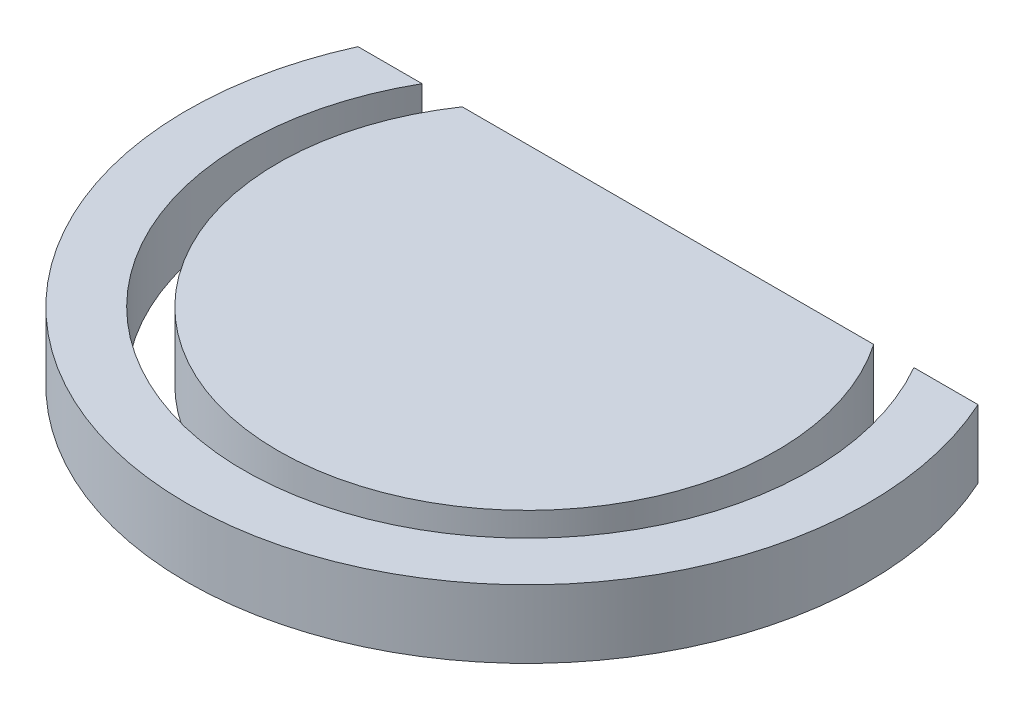
ISO-10303-21;
HEADER;
FILE_DESCRIPTION(('STEP AP214'),'2;1');
FILE_NAME('part.step','',(''),(''),'','','');
FILE_SCHEMA(('AUTOMOTIVE_DESIGN { 1 0 10303 214 1 1 1 1 }'));
ENDSEC;
DATA;
#1=APPLICATION_CONTEXT('core data for automotive mechanical design processes');
#2=APPLICATION_PROTOCOL_DEFINITION('international standard','automotive_design',2000,#1);
#3=PRODUCT_CONTEXT('',#1,'mechanical');
#4=PRODUCT('Part','Part','',(#3));
#5=PRODUCT_RELATED_PRODUCT_CATEGORY('part','',(#4));
#6=PRODUCT_DEFINITION_FORMATION('','',#4);
#7=PRODUCT_DEFINITION_CONTEXT('part definition',#1,'design');
#8=PRODUCT_DEFINITION('design','',#6,#7);
#9=PRODUCT_DEFINITION_SHAPE('','',#8);
#10=(LENGTH_UNIT() NAMED_UNIT(*) SI_UNIT(.MILLI.,.METRE.));
#11=(NAMED_UNIT(*) PLANE_ANGLE_UNIT() SI_UNIT($,.RADIAN.));
#12=(NAMED_UNIT(*) SI_UNIT($,.STERADIAN.) SOLID_ANGLE_UNIT());
#13=UNCERTAINTY_MEASURE_WITH_UNIT(LENGTH_MEASURE(1.E-05),#10,'distance_accuracy_value','');
#14=(GEOMETRIC_REPRESENTATION_CONTEXT(3) GLOBAL_UNCERTAINTY_ASSIGNED_CONTEXT((#13)) GLOBAL_UNIT_ASSIGNED_CONTEXT((#10,
#11,#12)) REPRESENTATION_CONTEXT('',''));
#15=CARTESIAN_POINT('',(0.,0.,0.));
#16=DIRECTION('',(0.,0.,1.));
#17=DIRECTION('',(1.,0.,0.));
#18=AXIS2_PLACEMENT_3D('',#15,#16,#17);
#19=CARTESIAN_POINT('',(0.,10.,0.));
#20=DIRECTION('',(0.,-1.,0.));
#21=DIRECTION('',(0.,0.,-1.));
#22=AXIS2_PLACEMENT_3D('',#19,#20,#21);
#23=CYLINDRICAL_SURFACE('',#22,41.6079905175903);
#24=CARTESIAN_POINT('',(0.,0.,0.));
#25=DIRECTION('',(0.,1.,0.));
#26=DIRECTION('',(0.,0.,1.));
#27=AXIS2_PLACEMENT_3D('',#24,#25,#26);
#28=CIRCLE('',#27,41.6079905175903);
#29=CARTESIAN_POINT('',(-36.113682010175,0.,-20.6646279080909));
#30=VERTEX_POINT('',#29);
#31=CARTESIAN_POINT('',(36.113682010175,0.,-20.6646279080909));
#32=VERTEX_POINT('',#31);
#33=EDGE_CURVE('E130',#30,#32,#28,.T.);
#34=ORIENTED_EDGE('',*,*,#33,.F.);
#35=DIRECTION('',(0.,-1.,0.));
#36=VECTOR('',#35,1.);
#37=CARTESIAN_POINT('',(-36.113682010175,10.,-20.6646279080909));
#38=LINE('',#37,#36);
#39=CARTESIAN_POINT('',(-36.113682010175,10.,-20.6646279080909));
#40=VERTEX_POINT('',#39);
#41=EDGE_CURVE('E13',#40,#30,#38,.T.);
#42=ORIENTED_EDGE('',*,*,#41,.F.);
#43=CARTESIAN_POINT('',(0.,10.,0.));
#44=DIRECTION('',(0.,1.,0.));
#45=DIRECTION('',(0.,0.,1.));
#46=AXIS2_PLACEMENT_3D('',#43,#44,#45);
#47=CIRCLE('',#46,41.6079905175903);
#48=CARTESIAN_POINT('',(36.113682010175,10.,-20.6646279080909));
#49=VERTEX_POINT('',#48);
#50=EDGE_CURVE('E119',#40,#49,#47,.T.);
#51=ORIENTED_EDGE('',*,*,#50,.T.);
#52=DIRECTION('',(0.,-1.,0.));
#53=VECTOR('',#52,1.);
#54=CARTESIAN_POINT('',(36.113682010175,10.,-20.6646279080909));
#55=LINE('',#54,#53);
#56=EDGE_CURVE('E108',#49,#32,#55,.T.);
#57=ORIENTED_EDGE('',*,*,#56,.T.);
#58=EDGE_LOOP('',(#34,#42,#51,#57));
#59=FACE_BOUND('',#58,.T.);
#60=ADVANCED_FACE('F69',(#59),#23,.F.);
#61=CARTESIAN_POINT('',(0.,10.,-20.6646279080909));
#62=DIRECTION('',(0.,0.,1.));
#63=DIRECTION('',(1.,0.,0.));
#64=AXIS2_PLACEMENT_3D('',#61,#62,#63);
#65=PLANE('',#64);
#66=DIRECTION('',(-1.,0.,0.));
#67=VECTOR('',#66,1.);
#68=CARTESIAN_POINT('',(0.,0.,-20.6646279080909));
#69=LINE('',#68,#67);
#70=CARTESIAN_POINT('',(-45.5299149287603,0.,-20.6646279080909));
#71=VERTEX_POINT('',#70);
#72=EDGE_CURVE('E124',#30,#71,#69,.T.);
#73=ORIENTED_EDGE('',*,*,#72,.T.);
#74=DIRECTION('',(0.,-1.,0.));
#75=VECTOR('',#74,1.);
#76=CARTESIAN_POINT('',(-45.5299149287603,10.,-20.6646279080909));
#77=LINE('',#76,#75);
#78=CARTESIAN_POINT('',(-45.5299149287603,10.,-20.6646279080909));
#79=VERTEX_POINT('',#78);
#80=EDGE_CURVE('E77',#79,#71,#77,.T.);
#81=ORIENTED_EDGE('',*,*,#80,.F.);
#82=DIRECTION('',(-1.,0.,0.));
#83=VECTOR('',#82,1.);
#84=CARTESIAN_POINT('',(0.,10.,-20.6646279080909));
#85=LINE('',#84,#83);
#86=EDGE_CURVE('E114',#40,#79,#85,.T.);
#87=ORIENTED_EDGE('',*,*,#86,.F.);
#88=ORIENTED_EDGE('',*,*,#41,.T.);
#89=EDGE_LOOP('',(#73,#81,#87,#88));
#90=FACE_BOUND('',#89,.T.);
#91=ADVANCED_FACE('F122',(#90),#65,.F.);
#92=CARTESIAN_POINT('',(0.,10.,0.));
#93=DIRECTION('',(0.,-1.,0.));
#94=DIRECTION('',(0.,0.,-1.));
#95=AXIS2_PLACEMENT_3D('',#92,#93,#94);
#96=CYLINDRICAL_SURFACE('',#95,50.);
#97=CARTESIAN_POINT('',(0.,0.,0.));
#98=DIRECTION('',(0.,1.,0.));
#99=DIRECTION('',(0.,0.,1.));
#100=AXIS2_PLACEMENT_3D('',#97,#98,#99);
#101=CIRCLE('',#100,50.);
#102=CARTESIAN_POINT('',(45.5299149287603,0.,-20.6646279080909));
#103=VERTEX_POINT('',#102);
#104=EDGE_CURVE('E101',#71,#103,#101,.T.);
#105=ORIENTED_EDGE('',*,*,#104,.T.);
#106=DIRECTION('',(0.,-1.,0.));
#107=VECTOR('',#106,1.);
#108=CARTESIAN_POINT('',(45.5299149287603,10.,-20.6646279080909));
#109=LINE('',#108,#107);
#110=CARTESIAN_POINT('',(45.5299149287603,10.,-20.6646279080909));
#111=VERTEX_POINT('',#110);
#112=EDGE_CURVE('E125',#111,#103,#109,.T.);
#113=ORIENTED_EDGE('',*,*,#112,.F.);
#114=CARTESIAN_POINT('',(0.,10.,0.));
#115=DIRECTION('',(0.,1.,0.));
#116=DIRECTION('',(0.,0.,1.));
#117=AXIS2_PLACEMENT_3D('',#114,#115,#116);
#118=CIRCLE('',#117,50.);
#119=EDGE_CURVE('E118',#79,#111,#118,.T.);
#120=ORIENTED_EDGE('',*,*,#119,.F.);
#121=ORIENTED_EDGE('',*,*,#80,.T.);
#122=EDGE_LOOP('',(#105,#113,#120,#121));
#123=FACE_BOUND('',#122,.T.);
#124=ADVANCED_FACE('F126',(#123),#96,.T.);
#125=EDGE_CURVE('E134',#103,#32,#69,.T.);
#126=ORIENTED_EDGE('',*,*,#125,.T.);
#127=ORIENTED_EDGE('',*,*,#56,.F.);
#128=EDGE_CURVE('E85',#111,#49,#85,.T.);
#129=ORIENTED_EDGE('',*,*,#128,.F.);
#130=ORIENTED_EDGE('',*,*,#112,.T.);
#131=EDGE_LOOP('',(#126,#127,#129,#130));
#132=FACE_BOUND('',#131,.T.);
#133=ADVANCED_FACE('F139',(#132),#65,.F.);
#134=CARTESIAN_POINT('',(0.,10.,0.));
#135=DIRECTION('',(0.,1.,0.));
#136=DIRECTION('',(0.,0.,1.));
#137=AXIS2_PLACEMENT_3D('',#134,#135,#136);
#138=PLANE('',#137);
#139=ORIENTED_EDGE('',*,*,#50,.F.);
#140=ORIENTED_EDGE('',*,*,#86,.T.);
#141=ORIENTED_EDGE('',*,*,#119,.T.);
#142=ORIENTED_EDGE('',*,*,#128,.T.);
#143=EDGE_LOOP('',(#139,#140,#141,#142));
#144=FACE_BOUND('',#143,.T.);
#145=ADVANCED_FACE('F116',(#144),#138,.T.);
#146=CARTESIAN_POINT('',(0.,0.,0.));
#147=DIRECTION('',(0.,1.,0.));
#148=DIRECTION('',(0.,0.,1.));
#149=AXIS2_PLACEMENT_3D('',#146,#147,#148);
#150=PLANE('',#149);
#151=ORIENTED_EDGE('',*,*,#33,.T.);
#152=ORIENTED_EDGE('',*,*,#125,.F.);
#153=ORIENTED_EDGE('',*,*,#104,.F.);
#154=ORIENTED_EDGE('',*,*,#72,.F.);
#155=EDGE_LOOP('',(#151,#152,#153,#154));
#156=FACE_BOUND('',#155,.T.);
#157=ADVANCED_FACE('F141',(#156),#150,.F.);
#158=CLOSED_SHELL('',(#60,#91,#124,#133,#145,#157));
#159=MANIFOLD_SOLID_BREP('B2',#158);
#160=CARTESIAN_POINT('',(0.,10.,-20.6646279080909));
#161=DIRECTION('',(0.,0.,1.));
#162=DIRECTION('',(1.,0.,0.));
#163=AXIS2_PLACEMENT_3D('',#160,#161,#162);
#164=PLANE('',#163);
#165=DIRECTION('',(-1.,0.,0.));
#166=VECTOR('',#165,1.);
#167=CARTESIAN_POINT('',(0.,0.,-20.6646279080909));
#168=LINE('',#167,#166);
#169=CARTESIAN_POINT('',(30.2178444492014,0.,-20.6646279080909));
#170=VERTEX_POINT('',#169);
#171=CARTESIAN_POINT('',(-30.2178444492014,0.,-20.6646279080909));
#172=VERTEX_POINT('',#171);
#173=EDGE_CURVE('E223',#170,#172,#168,.T.);
#174=ORIENTED_EDGE('',*,*,#173,.T.);
#175=DIRECTION('',(0.,-1.,0.));
#176=VECTOR('',#175,1.);
#177=CARTESIAN_POINT('',(-30.2178444492014,10.,-20.6646279080909));
#178=LINE('',#177,#176);
#179=CARTESIAN_POINT('',(-30.2178444492014,10.,-20.6646279080909));
#180=VERTEX_POINT('',#179);
#181=EDGE_CURVE('E67',#180,#172,#178,.T.);
#182=ORIENTED_EDGE('',*,*,#181,.F.);
#183=DIRECTION('',(-1.,0.,0.));
#184=VECTOR('',#183,1.);
#185=CARTESIAN_POINT('',(0.,10.,-20.6646279080909));
#186=LINE('',#185,#184);
#187=CARTESIAN_POINT('',(30.2178444492014,10.,-20.6646279080909));
#188=VERTEX_POINT('',#187);
#189=EDGE_CURVE('E222',#188,#180,#186,.T.);
#190=ORIENTED_EDGE('',*,*,#189,.F.);
#191=DIRECTION('',(0.,-1.,0.));
#192=VECTOR('',#191,1.);
#193=CARTESIAN_POINT('',(30.2178444492014,10.,-20.6646279080909));
#194=LINE('',#193,#192);
#195=EDGE_CURVE('E199',#188,#170,#194,.T.);
#196=ORIENTED_EDGE('',*,*,#195,.T.);
#197=EDGE_LOOP('',(#174,#182,#190,#196));
#198=FACE_BOUND('',#197,.T.);
#199=ADVANCED_FACE('F190',(#198),#164,.F.);
#200=CARTESIAN_POINT('',(0.,10.,0.));
#201=DIRECTION('',(0.,-1.,0.));
#202=DIRECTION('',(0.,0.,-1.));
#203=AXIS2_PLACEMENT_3D('',#200,#201,#202);
#204=CYLINDRICAL_SURFACE('',#203,36.6079905175903);
#205=CARTESIAN_POINT('',(0.,0.,0.));
#206=DIRECTION('',(0.,1.,0.));
#207=DIRECTION('',(0.,0.,1.));
#208=AXIS2_PLACEMENT_3D('',#205,#206,#207);
#209=CIRCLE('',#208,36.6079905175903);
#210=EDGE_CURVE('E214',#172,#170,#209,.T.);
#211=ORIENTED_EDGE('',*,*,#210,.T.);
#212=ORIENTED_EDGE('',*,*,#195,.F.);
#213=CARTESIAN_POINT('',(0.,10.,0.));
#214=DIRECTION('',(0.,1.,0.));
#215=DIRECTION('',(0.,0.,1.));
#216=AXIS2_PLACEMENT_3D('',#213,#214,#215);
#217=CIRCLE('',#216,36.6079905175903);
#218=EDGE_CURVE('E206',#180,#188,#217,.T.);
#219=ORIENTED_EDGE('',*,*,#218,.F.);
#220=ORIENTED_EDGE('',*,*,#181,.T.);
#221=EDGE_LOOP('',(#211,#212,#219,#220));
#222=FACE_BOUND('',#221,.T.);
#223=ADVANCED_FACE('F217',(#222),#204,.T.);
#224=CARTESIAN_POINT('',(0.,10.,0.));
#225=DIRECTION('',(0.,1.,0.));
#226=DIRECTION('',(0.,0.,1.));
#227=AXIS2_PLACEMENT_3D('',#224,#225,#226);
#228=PLANE('',#227);
#229=ORIENTED_EDGE('',*,*,#189,.T.);
#230=ORIENTED_EDGE('',*,*,#218,.T.);
#231=EDGE_LOOP('',(#229,#230));
#232=FACE_BOUND('',#231,.T.);
#233=ADVANCED_FACE('F234',(#232),#228,.T.);
#234=CARTESIAN_POINT('',(0.,0.,0.));
#235=DIRECTION('',(0.,1.,0.));
#236=DIRECTION('',(0.,0.,1.));
#237=AXIS2_PLACEMENT_3D('',#234,#235,#236);
#238=PLANE('',#237);
#239=ORIENTED_EDGE('',*,*,#173,.F.);
#240=ORIENTED_EDGE('',*,*,#210,.F.);
#241=EDGE_LOOP('',(#239,#240));
#242=FACE_BOUND('',#241,.T.);
#243=ADVANCED_FACE('F227',(#242),#238,.F.);
#244=CLOSED_SHELL('',(#199,#223,#233,#243));
#245=MANIFOLD_SOLID_BREP('B7',#244);
#246=ADVANCED_BREP_SHAPE_REPRESENTATION('',(#18,#159,#245),#14);
#247=SHAPE_DEFINITION_REPRESENTATION(#9,#246);
ENDSEC;
END-ISO-10303-21;
